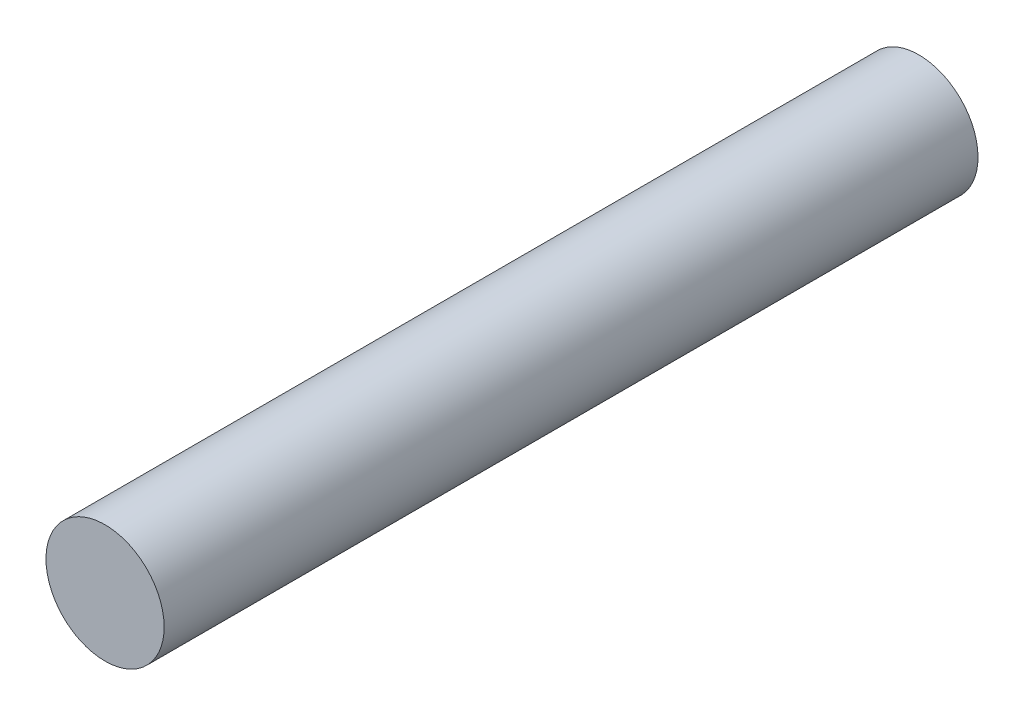
ISO-10303-21;
HEADER;
FILE_DESCRIPTION(('STEP AP214'),'2;1');
FILE_NAME('part.step','',(''),(''),'','','');
FILE_SCHEMA(('AUTOMOTIVE_DESIGN { 1 0 10303 214 1 1 1 1 }'));
ENDSEC;
DATA;
#1=APPLICATION_CONTEXT('core data for automotive mechanical design processes');
#2=APPLICATION_PROTOCOL_DEFINITION('international standard','automotive_design',2000,#1);
#3=PRODUCT_CONTEXT('',#1,'mechanical');
#4=PRODUCT('Part','Part','',(#3));
#5=PRODUCT_RELATED_PRODUCT_CATEGORY('part','',(#4));
#6=PRODUCT_DEFINITION_FORMATION('','',#4);
#7=PRODUCT_DEFINITION_CONTEXT('part definition',#1,'design');
#8=PRODUCT_DEFINITION('design','',#6,#7);
#9=PRODUCT_DEFINITION_SHAPE('','',#8);
#10=(LENGTH_UNIT() NAMED_UNIT(*) SI_UNIT(.MILLI.,.METRE.));
#11=(NAMED_UNIT(*) PLANE_ANGLE_UNIT() SI_UNIT($,.RADIAN.));
#12=(NAMED_UNIT(*) SI_UNIT($,.STERADIAN.) SOLID_ANGLE_UNIT());
#13=UNCERTAINTY_MEASURE_WITH_UNIT(LENGTH_MEASURE(1.E-05),#10,'distance_accuracy_value','');
#14=(GEOMETRIC_REPRESENTATION_CONTEXT(3) GLOBAL_UNCERTAINTY_ASSIGNED_CONTEXT((#13)) GLOBAL_UNIT_ASSIGNED_CONTEXT((#10,
#11,#12)) REPRESENTATION_CONTEXT('',''));
#15=CARTESIAN_POINT('',(0.,0.,0.));
#16=DIRECTION('',(0.,0.,1.));
#17=DIRECTION('',(1.,0.,0.));
#18=AXIS2_PLACEMENT_3D('',#15,#16,#17);
#19=CARTESIAN_POINT('',(-1.9701171875,-0.125,0.25));
#20=CARTESIAN_POINT('',(-1.9701171875,0.125,0.25));
#21=CARTESIAN_POINT('',(-1.7201171875,-0.125,0.25));
#22=CARTESIAN_POINT('',(-1.7201171875,0.125,0.25));
#23=(BOUNDED_SURFACE() B_SPLINE_SURFACE(1,1,((#19,#20),(#21,#22)),.UNSPECIFIED.,.F.,.F.,
.F.) B_SPLINE_SURFACE_WITH_KNOTS((2,2),(2,2),(-0.125,0.125),(-0.125,0.125),
.UNSPECIFIED.) GEOMETRIC_REPRESENTATION_ITEM() RATIONAL_B_SPLINE_SURFACE(((1.,1.),(1.,1.))) REPRESENTATION_ITEM('') SURFACE());
#24=CARTESIAN_POINT('',(-1.7201171875,0.,0.25));
#25=CARTESIAN_POINT('',(-1.7201171875,0.216506350946,0.25));
#26=CARTESIAN_POINT('',(-1.9076171875,0.108253175473,0.25));
#27=CARTESIAN_POINT('',(-2.0951171875,0.,0.25));
#28=CARTESIAN_POINT('',(-1.9076171875,-0.108253175473,0.25));
#29=CARTESIAN_POINT('',(-1.7201171875,-0.216506350946,0.25));
#30=CARTESIAN_POINT('',(-1.7201171875,0.,0.25));
#31=(BOUNDED_CURVE() B_SPLINE_CURVE(2,(#24,#25,#26,#27,#28,#29,#30),.UNSPECIFIED.,.T.,
.F.) B_SPLINE_CURVE_WITH_KNOTS((3,2,2,3),(0.,2.094395102393,4.188790204786,6.28318530718),
.UNSPECIFIED.) CURVE() GEOMETRIC_REPRESENTATION_ITEM() RATIONAL_B_SPLINE_CURVE((1.,0.5,1.,0.5,
1.,0.5,1.)) REPRESENTATION_ITEM(''));
#32=CARTESIAN_POINT('',(-1.7201171875,0.,0.25));
#33=VERTEX_POINT('',#32);
#34=EDGE_CURVE('E23',#33,#33,#31,.T.);
#35=ORIENTED_EDGE('',*,*,#34,.F.);
#36=EDGE_LOOP('',(#35));
#37=FACE_BOUND('',#36,.T.);
#38=ADVANCED_FACE('F17',(#37),#23,.F.);
#39=CARTESIAN_POINT('',(-1.9701171875,-0.125,1.971890713943));
#40=CARTESIAN_POINT('',(-1.9701171875,0.125,1.971890713943));
#41=CARTESIAN_POINT('',(-1.7201171875,-0.125,1.971890713943));
#42=CARTESIAN_POINT('',(-1.7201171875,0.125,1.971890713943));
#43=(BOUNDED_SURFACE() B_SPLINE_SURFACE(1,1,((#39,#40),(#41,#42)),.UNSPECIFIED.,.F.,.F.,
.F.) B_SPLINE_SURFACE_WITH_KNOTS((2,2),(2,2),(-0.125,0.125),(-0.125,0.125),
.UNSPECIFIED.) GEOMETRIC_REPRESENTATION_ITEM() RATIONAL_B_SPLINE_SURFACE(((1.,1.),(1.,1.))) REPRESENTATION_ITEM('') SURFACE());
#44=CARTESIAN_POINT('',(-1.7201171875,0.,1.971890713943));
#45=CARTESIAN_POINT('',(-1.7201171875,0.216506350946,1.971890713943));
#46=CARTESIAN_POINT('',(-1.9076171875,0.108253175473,1.971890713943));
#47=CARTESIAN_POINT('',(-2.0951171875,0.,1.971890713943));
#48=CARTESIAN_POINT('',(-1.9076171875,-0.108253175473,1.971890713943));
#49=CARTESIAN_POINT('',(-1.7201171875,-0.216506350946,1.971890713943));
#50=CARTESIAN_POINT('',(-1.7201171875,0.,1.971890713943));
#51=(BOUNDED_CURVE() B_SPLINE_CURVE(2,(#44,#45,#46,#47,#48,#49,#50),.UNSPECIFIED.,.T.,
.F.) B_SPLINE_CURVE_WITH_KNOTS((3,2,2,3),(0.,2.094395102393,4.188790204786,6.28318530718),
.UNSPECIFIED.) CURVE() GEOMETRIC_REPRESENTATION_ITEM() RATIONAL_B_SPLINE_CURVE((1.,0.5,1.,0.5,
1.,0.5,1.)) REPRESENTATION_ITEM(''));
#52=CARTESIAN_POINT('',(-1.7201171875,0.,1.971890713943));
#53=VERTEX_POINT('',#52);
#54=EDGE_CURVE('E11',#53,#53,#51,.T.);
#55=ORIENTED_EDGE('',*,*,#54,.T.);
#56=EDGE_LOOP('',(#55));
#57=FACE_BOUND('',#56,.T.);
#58=ADVANCED_FACE('F19',(#57),#43,.T.);
#59=CARTESIAN_POINT('',(-1.7201171875,0.,1.971890713943));
#60=CARTESIAN_POINT('',(-1.7201171875,0.,0.25));
#61=CARTESIAN_POINT('',(-1.7201171875,-0.216506350946,1.971890713943));
#62=CARTESIAN_POINT('',(-1.7201171875,-0.216506350946,0.25));
#63=CARTESIAN_POINT('',(-1.9076171875,-0.108253175473,1.971890713943));
#64=CARTESIAN_POINT('',(-1.9076171875,-0.108253175473,0.25));
#65=CARTESIAN_POINT('',(-2.0951171875,0.,1.971890713943));
#66=CARTESIAN_POINT('',(-2.0951171875,0.,0.25));
#67=CARTESIAN_POINT('',(-1.9076171875,0.108253175473,1.971890713943));
#68=CARTESIAN_POINT('',(-1.9076171875,0.108253175473,0.25));
#69=CARTESIAN_POINT('',(-1.7201171875,0.216506350946,1.971890713943));
#70=CARTESIAN_POINT('',(-1.7201171875,0.216506350946,0.25));
#71=CARTESIAN_POINT('',(-1.7201171875,0.,1.971890713943));
#72=CARTESIAN_POINT('',(-1.7201171875,0.,0.25));
#73=(BOUNDED_SURFACE() B_SPLINE_SURFACE(2,1,((#59,#60),(#61,#62),(#63,#64),(#65,#66),(#67,#68),
(#69,#70),(#71,#72)),.UNSPECIFIED.,.T.,.F.,.F.) B_SPLINE_SURFACE_WITH_KNOTS((3,2,2,3),(2,2),(0.,
2.094395102393,4.188790204786,6.28318530718),(0.,1.721890713943),
.UNSPECIFIED.) GEOMETRIC_REPRESENTATION_ITEM() RATIONAL_B_SPLINE_SURFACE(((1.,1.),(0.5,0.5),(1.,
1.),(0.5,0.5),(1.,1.),(0.5,0.5),(1.,1.))) REPRESENTATION_ITEM('') SURFACE());
#74=CARTESIAN_POINT('',(-1.7201171875,0.,1.971890713943));
#75=CARTESIAN_POINT('',(-1.7201171875,0.,0.25));
#76=(BOUNDED_CURVE() B_SPLINE_CURVE(1,(#74,#75),.UNSPECIFIED.,.F.,
.F.) B_SPLINE_CURVE_WITH_KNOTS((2,2),(0.,1.),
.UNSPECIFIED.) CURVE() GEOMETRIC_REPRESENTATION_ITEM() RATIONAL_B_SPLINE_CURVE((1.,1.)) REPRESENTATION_ITEM(''));
#77=EDGE_CURVE('E48',#53,#33,#76,.T.);
#78=ORIENTED_EDGE('',*,*,#77,.T.);
#79=ORIENTED_EDGE('',*,*,#34,.T.);
#80=ORIENTED_EDGE('',*,*,#77,.F.);
#81=ORIENTED_EDGE('',*,*,#54,.F.);
#82=EDGE_LOOP('',(#78,#79,#80,#81));
#83=FACE_BOUND('',#82,.T.);
#84=ADVANCED_FACE('F47',(#83),#73,.T.);
#85=CLOSED_SHELL('',(#38,#58,#84));
#86=MANIFOLD_SOLID_BREP('B1',#85);
#87=ADVANCED_BREP_SHAPE_REPRESENTATION('',(#18,#86),#14);
#88=SHAPE_DEFINITION_REPRESENTATION(#9,#87);
ENDSEC;
END-ISO-10303-21;
